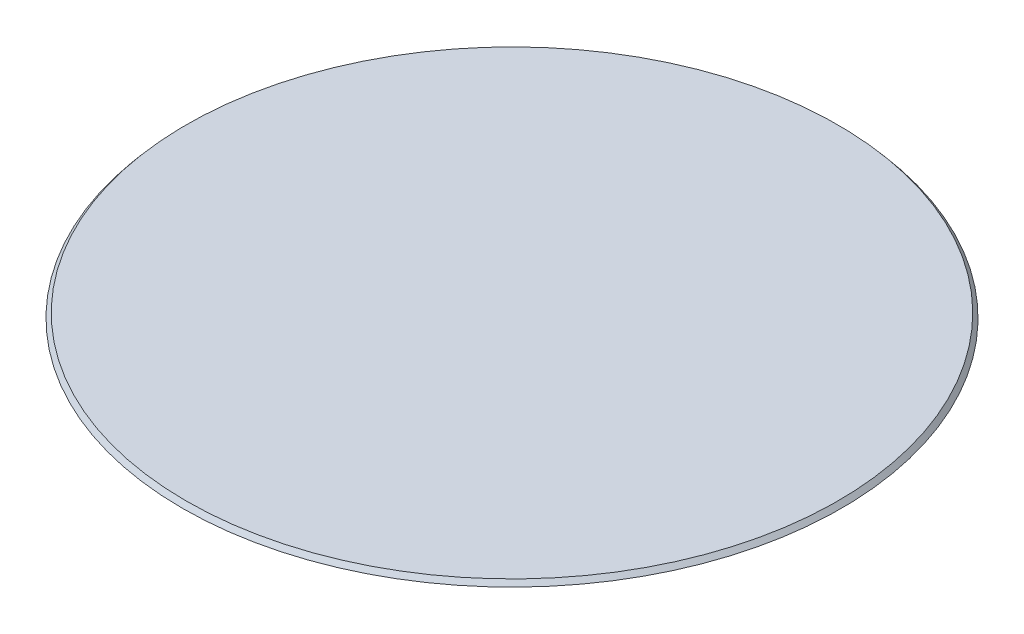
ISO-10303-21;
HEADER;
FILE_DESCRIPTION(('STEP AP214'),'2;1');
FILE_NAME('part.step','',(''),(''),'','','');
FILE_SCHEMA(('AUTOMOTIVE_DESIGN { 1 0 10303 214 1 1 1 1 }'));
ENDSEC;
DATA;
#1=APPLICATION_CONTEXT('core data for automotive mechanical design processes');
#2=APPLICATION_PROTOCOL_DEFINITION('international standard','automotive_design',2000,#1);
#3=PRODUCT_CONTEXT('',#1,'mechanical');
#4=PRODUCT('Part','Part','',(#3));
#5=PRODUCT_RELATED_PRODUCT_CATEGORY('part','',(#4));
#6=PRODUCT_DEFINITION_FORMATION('','',#4);
#7=PRODUCT_DEFINITION_CONTEXT('part definition',#1,'design');
#8=PRODUCT_DEFINITION('design','',#6,#7);
#9=PRODUCT_DEFINITION_SHAPE('','',#8);
#10=(LENGTH_UNIT() NAMED_UNIT(*) SI_UNIT(.MILLI.,.METRE.));
#11=(NAMED_UNIT(*) PLANE_ANGLE_UNIT() SI_UNIT($,.RADIAN.));
#12=(NAMED_UNIT(*) SI_UNIT($,.STERADIAN.) SOLID_ANGLE_UNIT());
#13=UNCERTAINTY_MEASURE_WITH_UNIT(LENGTH_MEASURE(1.E-05),#10,'distance_accuracy_value','');
#14=(GEOMETRIC_REPRESENTATION_CONTEXT(3) GLOBAL_UNCERTAINTY_ASSIGNED_CONTEXT((#13)) GLOBAL_UNIT_ASSIGNED_CONTEXT((#10,
#11,#12)) REPRESENTATION_CONTEXT('',''));
#15=CARTESIAN_POINT('',(0.,0.,0.));
#16=DIRECTION('',(0.,0.,1.));
#17=DIRECTION('',(1.,0.,0.));
#18=AXIS2_PLACEMENT_3D('',#15,#16,#17);
#19=CARTESIAN_POINT('',(0.,-1.9,-22.1));
#20=DIRECTION('',(0.,1.,0.));
#21=DIRECTION('',(0.,0.,1.));
#22=AXIS2_PLACEMENT_3D('',#19,#20,#21);
#23=PLANE('',#22);
#24=CARTESIAN_POINT('',(0.,-1.9,0.));
#25=DIRECTION('',(0.,-1.,0.));
#26=DIRECTION('',(0.58778525229248,0.,-0.809016994374942));
#27=AXIS2_PLACEMENT_3D('',#24,#25,#26);
#28=CIRCLE('',#27,20.5);
#29=CARTESIAN_POINT('',(3.1589869183563,-1.9,-20.2551425976134));
#30=VERTEX_POINT('',#29);
#31=CARTESIAN_POINT('',(18.2876047131677,-1.9,-9.26355837974405));
#32=VERTEX_POINT('',#31);
#33=EDGE_CURVE('E219',#30,#32,#28,.T.);
#34=ORIENTED_EDGE('',*,*,#33,.F.);
#35=DIRECTION('',(-0.183146099896373,0.,-0.983085706382077));
#36=VECTOR('',#35,1.);
#37=CARTESIAN_POINT('',(3.1589869183563,-1.9,-20.2551425976134));
#38=LINE('',#37,#36);
#39=CARTESIAN_POINT('',(4.54643522794369,-1.9,-12.8076424746455));
#40=VERTEX_POINT('',#39);
#41=EDGE_CURVE('E212',#40,#30,#38,.T.);
#42=ORIENTED_EDGE('',*,*,#41,.F.);
#43=CARTESIAN_POINT('',(10.0502544351917,-1.9,-13.8329885007329));
#44=DIRECTION('',(0.,-1.,0.));
#45=DIRECTION('',(0.58778525229248,0.,-0.809016994374942));
#46=AXIS2_PLACEMENT_3D('',#43,#44,#45);
#47=CIRCLE('',#46,5.59851411887886);
#48=CARTESIAN_POINT('',(10.7758660846307,-1.9,-8.28169603199335));
#49=VERTEX_POINT('',#48);
#50=EDGE_CURVE('E226',#49,#40,#47,.T.);
#51=ORIENTED_EDGE('',*,*,#50,.F.);
#52=DIRECTION('',(-0.991565324452772,0.,0.129607898458655));
#53=VECTOR('',#52,1.);
#54=CARTESIAN_POINT('',(10.7758660846307,-1.9,-8.28169603199335));
#55=LINE('',#54,#53);
#56=EDGE_CURVE('E222',#32,#49,#55,.T.);
#57=ORIENTED_EDGE('',*,*,#56,.F.);
#58=EDGE_LOOP('',(#34,#42,#51,#57));
#59=FACE_BOUND('',#58,.T.);
#60=CARTESIAN_POINT('',(0.,-1.9,0.));
#61=DIRECTION('',(0.,-1.,0.));
#62=DIRECTION('',(-0.951056516295155,0.,0.309016994374945));
#63=AXIS2_PLACEMENT_3D('',#60,#61,#62);
#64=CIRCLE('',#63,20.5);
#65=CARTESIAN_POINT('',(-14.4613482039165,-1.9,14.5299486621626));
#66=VERTEX_POINT('',#65);
#67=CARTESIAN_POINT('',(-20.239965998728,-1.9,-3.2548081925568));
#68=VERTEX_POINT('',#67);
#69=EDGE_CURVE('E199',#66,#68,#64,.T.);
#70=ORIENTED_EDGE('',*,*,#69,.F.);
#71=DIRECTION('',(-0.429674972681251,0.,0.902983619924175));
#72=VECTOR('',#71,1.);
#73=CARTESIAN_POINT('',(-14.4613482039165,-1.9,14.5299486621626));
#74=LINE('',#73,#72);
#75=CARTESIAN_POINT('',(-11.2062867264626,-1.9,7.68927284237837));
#76=VERTEX_POINT('',#75);
#77=EDGE_CURVE('E273',#76,#66,#74,.T.);
#78=ORIENTED_EDGE('',*,*,#77,.F.);
#79=CARTESIAN_POINT('',(-16.2616532717244,-1.9,5.28373144129351));
#80=DIRECTION('',(0.,-1.,0.));
#81=DIRECTION('',(-0.951056516295155,0.,0.309016994374945));
#82=AXIS2_PLACEMENT_3D('',#79,#80,#81);
#83=CIRCLE('',#82,5.59851411887886);
#84=CARTESIAN_POINT('',(-13.5857175831497,-1.9,0.366137666905687));
#85=VERTEX_POINT('',#84);
#86=EDGE_CURVE('E282',#85,#76,#83,.T.);
#87=ORIENTED_EDGE('',*,*,#86,.F.);
#88=DIRECTION('',(0.878374809809822,0.,0.477972481939661));
#89=VECTOR('',#88,1.);
#90=CARTESIAN_POINT('',(-13.5857175831497,-1.9,0.366137666905685));
#91=LINE('',#90,#89);
#92=EDGE_CURVE('E202',#68,#85,#91,.T.);
#93=ORIENTED_EDGE('',*,*,#92,.F.);
#94=EDGE_LOOP('',(#70,#78,#87,#93));
#95=FACE_BOUND('',#94,.T.);
#96=CARTESIAN_POINT('',(0.,-1.9,0.));
#97=DIRECTION('',(0.,1.,0.));
#98=DIRECTION('',(0.,0.,1.));
#99=AXIS2_PLACEMENT_3D('',#96,#97,#98);
#100=CIRCLE('',#99,22.1);
#101=CARTESIAN_POINT('',(0.,-1.9,22.1));
#102=VERTEX_POINT('',#101);
#103=EDGE_CURVE('E331',#102,#102,#100,.T.);
#104=ORIENTED_EDGE('',*,*,#103,.F.);
#105=EDGE_LOOP('',(#104));
#106=FACE_BOUND('',#105,.T.);
#107=CARTESIAN_POINT('',(0.,-1.9,0.));
#108=DIRECTION('',(0.,-1.,0.));
#109=DIRECTION('',(0.,0.,1.));
#110=AXIS2_PLACEMENT_3D('',#107,#108,#109);
#111=CIRCLE('',#110,20.5);
#112=CARTESIAN_POINT('',(9.35,-1.9,18.2435605077518));
#113=VERTEX_POINT('',#112);
#114=CARTESIAN_POINT('',(-9.35,-1.9,18.2435605077518));
#115=VERTEX_POINT('',#114);
#116=EDGE_CURVE('E298',#113,#115,#111,.T.);
#117=ORIENTED_EDGE('',*,*,#116,.F.);
#118=DIRECTION('',(0.726011587220577,0.,0.687682466856222));
#119=VECTOR('',#118,1.);
#120=CARTESIAN_POINT('',(9.35,-1.9,18.2435605077518));
#121=LINE('',#120,#119);
#122=CARTESIAN_POINT('',(3.85,-1.9,13.0339279973548));
#123=VERTEX_POINT('',#122);
#124=EDGE_CURVE('E303',#123,#113,#121,.T.);
#125=ORIENTED_EDGE('',*,*,#124,.F.);
#126=CARTESIAN_POINT('',(0.,-1.9,17.0985141188789));
#127=DIRECTION('',(0.,-1.,0.));
#128=DIRECTION('',(0.,0.,1.));
#129=AXIS2_PLACEMENT_3D('',#126,#127,#128);
#130=CIRCLE('',#129,5.59851411887886);
#131=CARTESIAN_POINT('',(-3.85,-1.9,13.0339279973548));
#132=VERTEX_POINT('',#131);
#133=EDGE_CURVE('E315',#132,#123,#130,.T.);
#134=ORIENTED_EDGE('',*,*,#133,.F.);
#135=DIRECTION('',(0.726011587220577,0.,-0.687682466856221));
#136=VECTOR('',#135,1.);
#137=CARTESIAN_POINT('',(-3.85,-1.9,13.0339279973548));
#138=LINE('',#137,#136);
#139=EDGE_CURVE('E312',#115,#132,#138,.T.);
#140=ORIENTED_EDGE('',*,*,#139,.F.);
#141=EDGE_LOOP('',(#117,#125,#134,#140));
#142=FACE_BOUND('',#141,.T.);
#143=CARTESIAN_POINT('',(0.,-1.9,0.));
#144=DIRECTION('',(0.,-1.,0.));
#145=DIRECTION('',(-0.587785252292469,0.,-0.809016994374951));
#146=AXIS2_PLACEMENT_3D('',#143,#144,#145);
#147=CIRCLE('',#146,20.5);
#148=CARTESIAN_POINT('',(-18.2876047131676,-1.9,-9.26355837974431));
#149=VERTEX_POINT('',#148);
#150=CARTESIAN_POINT('',(-3.15898691835601,-1.9,-20.2551425976135));
#151=VERTEX_POINT('',#150);
#152=EDGE_CURVE('E198',#149,#151,#147,.T.);
#153=ORIENTED_EDGE('',*,*,#152,.F.);
#154=DIRECTION('',(-0.99156532445277,0.,-0.12960789845867));
#155=VECTOR('',#154,1.);
#156=CARTESIAN_POINT('',(-18.2876047131676,-1.9,-9.26355837974431));
#157=LINE('',#156,#155);
#158=CARTESIAN_POINT('',(-10.7758660846306,-1.9,-8.28169603199351));
#159=VERTEX_POINT('',#158);
#160=EDGE_CURVE('E195',#159,#149,#157,.T.);
#161=ORIENTED_EDGE('',*,*,#160,.F.);
#162=CARTESIAN_POINT('',(-10.0502544351916,-1.9,-13.832988500733));
#163=DIRECTION('',(0.,-1.,0.));
#164=DIRECTION('',(-0.587785252292469,0.,-0.809016994374951));
#165=AXIS2_PLACEMENT_3D('',#162,#163,#164);
#166=CIRCLE('',#165,5.59851411887886);
#167=CARTESIAN_POINT('',(-4.54643522794351,-1.9,-12.8076424746455));
#168=VERTEX_POINT('',#167);
#169=EDGE_CURVE('E693',#168,#159,#166,.T.);
#170=ORIENTED_EDGE('',*,*,#169,.F.);
#171=DIRECTION('',(-0.183146099896387,0.,0.983085706382075));
#172=VECTOR('',#171,1.);
#173=CARTESIAN_POINT('',(-4.54643522794351,-1.9,-12.8076424746455));
#174=LINE('',#173,#172);
#175=EDGE_CURVE('E699',#151,#168,#174,.T.);
#176=ORIENTED_EDGE('',*,*,#175,.F.);
#177=EDGE_LOOP('',(#153,#161,#170,#176));
#178=FACE_BOUND('',#177,.T.);
#179=CARTESIAN_POINT('',(0.,-1.9,0.));
#180=DIRECTION('',(0.,-1.,0.));
#181=DIRECTION('',(0.95105651629515,0.,0.309016994374958));
#182=AXIS2_PLACEMENT_3D('',#179,#180,#181);
#183=CIRCLE('',#182,20.5);
#184=CARTESIAN_POINT('',(20.239965998728,-1.9,-3.25480819255651));
#185=VERTEX_POINT('',#184);
#186=CARTESIAN_POINT('',(14.4613482039163,-1.9,14.5299486621628));
#187=VERTEX_POINT('',#186);
#188=EDGE_CURVE('E253',#185,#187,#183,.T.);
#189=ORIENTED_EDGE('',*,*,#188,.F.);
#190=DIRECTION('',(0.878374809809829,0.,-0.477972481939648));
#191=VECTOR('',#190,1.);
#192=CARTESIAN_POINT('',(20.239965998728,-1.9,-3.25480819255651));
#193=LINE('',#192,#191);
#194=CARTESIAN_POINT('',(13.5857175831497,-1.9,0.366137666905871));
#195=VERTEX_POINT('',#194);
#196=EDGE_CURVE('E246',#195,#185,#193,.T.);
#197=ORIENTED_EDGE('',*,*,#196,.F.);
#198=CARTESIAN_POINT('',(16.2616532717244,-1.9,5.28373144129373));
#199=DIRECTION('',(0.,-1.,0.));
#200=DIRECTION('',(0.95105651629515,0.,0.309016994374958));
#201=AXIS2_PLACEMENT_3D('',#198,#199,#200);
#202=CIRCLE('',#201,5.59851411887886);
#203=CARTESIAN_POINT('',(11.2062867264625,-1.9,7.68927284237853));
#204=VERTEX_POINT('',#203);
#205=EDGE_CURVE('E59',#204,#195,#202,.T.);
#206=ORIENTED_EDGE('',*,*,#205,.F.);
#207=DIRECTION('',(-0.429674972681237,0.,-0.902983619924181));
#208=VECTOR('',#207,1.);
#209=CARTESIAN_POINT('',(11.2062867264625,-1.9,7.68927284237853));
#210=LINE('',#209,#208);
#211=EDGE_CURVE('E54',#187,#204,#210,.T.);
#212=ORIENTED_EDGE('',*,*,#211,.F.);
#213=EDGE_LOOP('',(#189,#197,#206,#212));
#214=FACE_BOUND('',#213,.T.);
#215=ADVANCED_FACE('F39',(#59,#95,#106,#142,#178,#214),#23,.F.);
#216=CARTESIAN_POINT('',(0.,0.,0.));
#217=DIRECTION('',(0.,-1.,0.));
#218=DIRECTION('',(0.,0.,-1.));
#219=AXIS2_PLACEMENT_3D('',#216,#217,#218);
#220=PLANE('',#219);
#221=CARTESIAN_POINT('',(0.,0.,0.));
#222=DIRECTION('',(0.,1.,0.));
#223=DIRECTION('',(0.,0.,1.));
#224=AXIS2_PLACEMENT_3D('',#221,#222,#223);
#225=CIRCLE('',#224,29.1643601475291);
#226=CARTESIAN_POINT('',(0.,0.,29.1643601475291));
#227=VERTEX_POINT('',#226);
#228=EDGE_CURVE('E11',#227,#227,#225,.T.);
#229=ORIENTED_EDGE('',*,*,#228,.T.);
#230=EDGE_LOOP('',(#229));
#231=FACE_BOUND('',#230,.T.);
#232=ADVANCED_FACE('F41',(#231),#220,.F.);
#233=CARTESIAN_POINT('',(0.,-0.399999999999998,0.));
#234=DIRECTION('',(0.,-1.,0.));
#235=DIRECTION('',(0.,0.,-1.));
#236=AXIS2_PLACEMENT_3D('',#233,#234,#235);
#237=CONICAL_SURFACE('',#236,29.5,0.698131700797735);
#238=ORIENTED_EDGE('',*,*,#228,.F.);
#239=EDGE_LOOP('',(#238));
#240=FACE_BOUND('',#239,.T.);
#241=CARTESIAN_POINT('',(0.,-0.399999999999998,0.));
#242=DIRECTION('',(0.,1.,0.));
#243=DIRECTION('',(0.,0.,1.));
#244=AXIS2_PLACEMENT_3D('',#241,#242,#243);
#245=CIRCLE('',#244,29.5);
#246=CARTESIAN_POINT('',(0.,-0.399999999999998,29.5));
#247=VERTEX_POINT('',#246);
#248=EDGE_CURVE('E47',#247,#247,#245,.T.);
#249=ORIENTED_EDGE('',*,*,#248,.T.);
#250=EDGE_LOOP('',(#249));
#251=FACE_BOUND('',#250,.T.);
#252=ADVANCED_FACE('F345',(#240,#251),#237,.T.);
#253=CARTESIAN_POINT('',(0.,-1.9,0.));
#254=DIRECTION('',(0.,1.,0.));
#255=DIRECTION('',(0.,0.,1.));
#256=AXIS2_PLACEMENT_3D('',#253,#254,#255);
#257=CONICAL_SURFACE('',#256,26.2,1.14416883366802);
#258=ORIENTED_EDGE('',*,*,#248,.F.);
#259=EDGE_LOOP('',(#258));
#260=FACE_BOUND('',#259,.T.);
#261=CARTESIAN_POINT('',(0.,-1.9,0.));
#262=DIRECTION('',(0.,1.,0.));
#263=DIRECTION('',(0.,0.,1.));
#264=AXIS2_PLACEMENT_3D('',#261,#262,#263);
#265=CIRCLE('',#264,26.2);
#266=CARTESIAN_POINT('',(0.,-1.9,26.2));
#267=VERTEX_POINT('',#266);
#268=EDGE_CURVE('E340',#267,#267,#265,.T.);
#269=ORIENTED_EDGE('',*,*,#268,.T.);
#270=EDGE_LOOP('',(#269));
#271=FACE_BOUND('',#270,.T.);
#272=ADVANCED_FACE('F347',(#260,#271),#257,.T.);
#273=CARTESIAN_POINT('',(0.,64.33779776,0.));
#274=DIRECTION('',(0.,1.,0.));
#275=DIRECTION('',(0.,0.,1.));
#276=AXIS2_PLACEMENT_3D('',#273,#274,#275);
#277=CYLINDRICAL_SURFACE('',#276,26.2);
#278=ORIENTED_EDGE('',*,*,#268,.F.);
#279=EDGE_LOOP('',(#278));
#280=FACE_BOUND('',#279,.T.);
#281=CARTESIAN_POINT('',(0.,-0.899999999999998,0.));
#282=DIRECTION('',(0.,1.,0.));
#283=DIRECTION('',(0.,0.,1.));
#284=AXIS2_PLACEMENT_3D('',#281,#282,#283);
#285=CIRCLE('',#284,26.2);
#286=CARTESIAN_POINT('',(0.,-0.899999999999998,26.2));
#287=VERTEX_POINT('',#286);
#288=EDGE_CURVE('E337',#287,#287,#285,.T.);
#289=ORIENTED_EDGE('',*,*,#288,.T.);
#290=EDGE_LOOP('',(#289));
#291=FACE_BOUND('',#290,.T.);
#292=ADVANCED_FACE('F350',(#280,#291),#277,.F.);
#293=CARTESIAN_POINT('',(0.,-0.9,-26.2));
#294=DIRECTION('',(0.,1.,0.));
#295=DIRECTION('',(0.,0.,1.));
#296=AXIS2_PLACEMENT_3D('',#293,#294,#295);
#297=PLANE('',#296);
#298=ORIENTED_EDGE('',*,*,#288,.F.);
#299=EDGE_LOOP('',(#298));
#300=FACE_BOUND('',#299,.T.);
#301=CARTESIAN_POINT('',(0.,-0.899999999999998,0.));
#302=DIRECTION('',(0.,1.,0.));
#303=DIRECTION('',(0.,0.,1.));
#304=AXIS2_PLACEMENT_3D('',#301,#302,#303);
#305=CIRCLE('',#304,22.1);
#306=CARTESIAN_POINT('',(0.,-0.899999999999998,22.1));
#307=VERTEX_POINT('',#306);
#308=EDGE_CURVE('E334',#307,#307,#305,.T.);
#309=ORIENTED_EDGE('',*,*,#308,.T.);
#310=EDGE_LOOP('',(#309));
#311=FACE_BOUND('',#310,.T.);
#312=ADVANCED_FACE('F356',(#300,#311),#297,.F.);
#313=CARTESIAN_POINT('',(0.,64.33779776,0.));
#314=DIRECTION('',(0.,1.,0.));
#315=DIRECTION('',(0.,0.,1.));
#316=AXIS2_PLACEMENT_3D('',#313,#314,#315);
#317=CYLINDRICAL_SURFACE('',#316,22.1);
#318=ORIENTED_EDGE('',*,*,#308,.F.);
#319=EDGE_LOOP('',(#318));
#320=FACE_BOUND('',#319,.T.);
#321=ORIENTED_EDGE('',*,*,#103,.T.);
#322=EDGE_LOOP('',(#321));
#323=FACE_BOUND('',#322,.T.);
#324=ADVANCED_FACE('F362',(#320,#323),#317,.T.);
#325=CARTESIAN_POINT('',(0.,-5.9,0.));
#326=DIRECTION('',(0.,1.,0.));
#327=DIRECTION('',(0.,0.,1.));
#328=AXIS2_PLACEMENT_3D('',#325,#326,#327);
#329=CYLINDRICAL_SURFACE('',#328,20.5);
#330=ORIENTED_EDGE('',*,*,#116,.T.);
#331=DIRECTION('',(0.,1.,0.));
#332=VECTOR('',#331,1.);
#333=CARTESIAN_POINT('',(-9.35,-5.9,18.2435605077518));
#334=LINE('',#333,#332);
#335=CARTESIAN_POINT('',(-9.35,-5.9,18.2435605077518));
#336=VERTEX_POINT('',#335);
#337=EDGE_CURVE('E328',#336,#115,#334,.T.);
#338=ORIENTED_EDGE('',*,*,#337,.F.);
#339=CARTESIAN_POINT('',(0.,-5.9,0.));
#340=DIRECTION('',(0.,-1.,0.));
#341=DIRECTION('',(0.,0.,1.));
#342=AXIS2_PLACEMENT_3D('',#339,#340,#341);
#343=CIRCLE('',#342,20.5);
#344=CARTESIAN_POINT('',(9.35,-5.9,18.2435605077518));
#345=VERTEX_POINT('',#344);
#346=EDGE_CURVE('E299',#345,#336,#343,.T.);
#347=ORIENTED_EDGE('',*,*,#346,.F.);
#348=DIRECTION('',(0.,1.,0.));
#349=VECTOR('',#348,1.);
#350=CARTESIAN_POINT('',(9.35,-5.9,18.2435605077518));
#351=LINE('',#350,#349);
#352=EDGE_CURVE('E309',#345,#113,#351,.T.);
#353=ORIENTED_EDGE('',*,*,#352,.T.);
#354=EDGE_LOOP('',(#330,#338,#347,#353));
#355=FACE_BOUND('',#354,.T.);
#356=ADVANCED_FACE('F368',(#355),#329,.T.);
#357=CARTESIAN_POINT('',(-3.85,-5.9,13.0339279973548));
#358=DIRECTION('',(0.687682466856222,0.,0.726011587220577));
#359=DIRECTION('',(0.726011587220577,0.,-0.687682466856222));
#360=AXIS2_PLACEMENT_3D('',#357,#358,#359);
#361=PLANE('',#360);
#362=ORIENTED_EDGE('',*,*,#139,.T.);
#363=DIRECTION('',(0.,1.,0.));
#364=VECTOR('',#363,1.);
#365=CARTESIAN_POINT('',(-3.85,-5.9,13.0339279973548));
#366=LINE('',#365,#364);
#367=CARTESIAN_POINT('',(-3.85,-5.9,13.0339279973548));
#368=VERTEX_POINT('',#367);
#369=EDGE_CURVE('E325',#368,#132,#366,.T.);
#370=ORIENTED_EDGE('',*,*,#369,.F.);
#371=DIRECTION('',(0.726011587220577,0.,-0.687682466856221));
#372=VECTOR('',#371,1.);
#373=CARTESIAN_POINT('',(-3.85,-5.9,13.0339279973548));
#374=LINE('',#373,#372);
#375=EDGE_CURVE('E302',#336,#368,#374,.T.);
#376=ORIENTED_EDGE('',*,*,#375,.F.);
#377=ORIENTED_EDGE('',*,*,#337,.T.);
#378=EDGE_LOOP('',(#362,#370,#376,#377));
#379=FACE_BOUND('',#378,.T.);
#380=ADVANCED_FACE('F437',(#379),#361,.F.);
#381=CARTESIAN_POINT('',(0.,-5.9,17.0985141188789));
#382=DIRECTION('',(0.,1.,0.));
#383=DIRECTION('',(0.,0.,1.));
#384=AXIS2_PLACEMENT_3D('',#381,#382,#383);
#385=CYLINDRICAL_SURFACE('',#384,5.59851411887886);
#386=ORIENTED_EDGE('',*,*,#133,.T.);
#387=DIRECTION('',(0.,1.,0.));
#388=VECTOR('',#387,1.);
#389=CARTESIAN_POINT('',(3.85,-5.9,13.0339279973548));
#390=LINE('',#389,#388);
#391=CARTESIAN_POINT('',(3.85,-5.9,13.0339279973548));
#392=VERTEX_POINT('',#391);
#393=EDGE_CURVE('E322',#392,#123,#390,.T.);
#394=ORIENTED_EDGE('',*,*,#393,.F.);
#395=CARTESIAN_POINT('',(0.,-5.9,17.0985141188789));
#396=DIRECTION('',(0.,-1.,0.));
#397=DIRECTION('',(0.,0.,1.));
#398=AXIS2_PLACEMENT_3D('',#395,#396,#397);
#399=CIRCLE('',#398,5.59851411887886);
#400=EDGE_CURVE('E305',#368,#392,#399,.T.);
#401=ORIENTED_EDGE('',*,*,#400,.F.);
#402=ORIENTED_EDGE('',*,*,#369,.T.);
#403=EDGE_LOOP('',(#386,#394,#401,#402));
#404=FACE_BOUND('',#403,.T.);
#405=ADVANCED_FACE('F433',(#404),#385,.T.);
#406=CARTESIAN_POINT('',(9.35,-5.9,18.2435605077518));
#407=DIRECTION('',(-0.687682466856222,0.,0.726011587220577));
#408=DIRECTION('',(0.726011587220577,0.,0.687682466856222));
#409=AXIS2_PLACEMENT_3D('',#406,#407,#408);
#410=PLANE('',#409);
#411=ORIENTED_EDGE('',*,*,#124,.T.);
#412=ORIENTED_EDGE('',*,*,#352,.F.);
#413=DIRECTION('',(0.726011587220577,0.,0.687682466856222));
#414=VECTOR('',#413,1.);
#415=CARTESIAN_POINT('',(9.35,-5.9,18.2435605077518));
#416=LINE('',#415,#414);
#417=EDGE_CURVE('E307',#392,#345,#416,.T.);
#418=ORIENTED_EDGE('',*,*,#417,.F.);
#419=ORIENTED_EDGE('',*,*,#393,.T.);
#420=EDGE_LOOP('',(#411,#412,#418,#419));
#421=FACE_BOUND('',#420,.T.);
#422=ADVANCED_FACE('F429',(#421),#410,.F.);
#423=CARTESIAN_POINT('',(0.,-5.9,0.));
#424=DIRECTION('',(0.,1.,0.));
#425=DIRECTION('',(0.,0.,1.));
#426=AXIS2_PLACEMENT_3D('',#423,#424,#425);
#427=PLANE('',#426);
#428=ORIENTED_EDGE('',*,*,#346,.T.);
#429=ORIENTED_EDGE('',*,*,#375,.T.);
#430=ORIENTED_EDGE('',*,*,#400,.T.);
#431=ORIENTED_EDGE('',*,*,#417,.T.);
#432=EDGE_LOOP('',(#428,#429,#430,#431));
#433=FACE_BOUND('',#432,.T.);
#434=ADVANCED_FACE('F425',(#433),#427,.F.);
#435=CARTESIAN_POINT('',(0.,-5.9,0.));
#436=DIRECTION('',(0.,1.,0.));
#437=DIRECTION('',(0.,0.,1.));
#438=AXIS2_PLACEMENT_3D('',#435,#436,#437);
#439=CYLINDRICAL_SURFACE('',#438,20.5);
#440=ORIENTED_EDGE('',*,*,#69,.T.);
#441=DIRECTION('',(0.,1.,0.));
#442=VECTOR('',#441,1.);
#443=CARTESIAN_POINT('',(-20.239965998728,-5.9,-3.2548081925568));
#444=LINE('',#443,#442);
#445=CARTESIAN_POINT('',(-20.239965998728,-5.9,-3.2548081925568));
#446=VERTEX_POINT('',#445);
#447=EDGE_CURVE('E295',#446,#68,#444,.T.);
#448=ORIENTED_EDGE('',*,*,#447,.F.);
#449=CARTESIAN_POINT('',(0.,-5.9,0.));
#450=DIRECTION('',(0.,-1.,0.));
#451=DIRECTION('',(-0.951056516295155,0.,0.309016994374945));
#452=AXIS2_PLACEMENT_3D('',#449,#450,#451);
#453=CIRCLE('',#452,20.5);
#454=CARTESIAN_POINT('',(-14.4613482039165,-5.9,14.5299486621626));
#455=VERTEX_POINT('',#454);
#456=EDGE_CURVE('E269',#455,#446,#453,.T.);
#457=ORIENTED_EDGE('',*,*,#456,.F.);
#458=DIRECTION('',(0.,1.,0.));
#459=VECTOR('',#458,1.);
#460=CARTESIAN_POINT('',(-14.4613482039165,-5.9,14.5299486621626));
#461=LINE('',#460,#459);
#462=EDGE_CURVE('E278',#455,#66,#461,.T.);
#463=ORIENTED_EDGE('',*,*,#462,.T.);
#464=EDGE_LOOP('',(#440,#448,#457,#463));
#465=FACE_BOUND('',#464,.T.);
#466=ADVANCED_FACE('F421',(#465),#439,.T.);
#467=CARTESIAN_POINT('',(-13.5857175831497,-5.9,0.366137666905685));
#468=DIRECTION('',(-0.477972481939661,0.,0.878374809809822));
#469=DIRECTION('',(0.878374809809822,0.,0.477972481939661));
#470=AXIS2_PLACEMENT_3D('',#467,#468,#469);
#471=PLANE('',#470);
#472=ORIENTED_EDGE('',*,*,#92,.T.);
#473=DIRECTION('',(0.,1.,0.));
#474=VECTOR('',#473,1.);
#475=CARTESIAN_POINT('',(-13.5857175831497,-5.9,0.366137666905685));
#476=LINE('',#475,#474);
#477=CARTESIAN_POINT('',(-13.5857175831497,-5.9,0.366137666905685));
#478=VERTEX_POINT('',#477);
#479=EDGE_CURVE('E292',#478,#85,#476,.T.);
#480=ORIENTED_EDGE('',*,*,#479,.F.);
#481=DIRECTION('',(0.878374809809822,0.,0.477972481939661));
#482=VECTOR('',#481,1.);
#483=CARTESIAN_POINT('',(-13.5857175831497,-5.9,0.366137666905685));
#484=LINE('',#483,#482);
#485=EDGE_CURVE('E272',#446,#478,#484,.T.);
#486=ORIENTED_EDGE('',*,*,#485,.F.);
#487=ORIENTED_EDGE('',*,*,#447,.T.);
#488=EDGE_LOOP('',(#472,#480,#486,#487));
#489=FACE_BOUND('',#488,.T.);
#490=ADVANCED_FACE('F417',(#489),#471,.F.);
#491=CARTESIAN_POINT('',(-16.2616532717244,-5.9,5.28373144129351));
#492=DIRECTION('',(0.,1.,0.));
#493=DIRECTION('',(0.,0.,1.));
#494=AXIS2_PLACEMENT_3D('',#491,#492,#493);
#495=CYLINDRICAL_SURFACE('',#494,5.59851411887886);
#496=ORIENTED_EDGE('',*,*,#86,.T.);
#497=DIRECTION('',(0.,1.,0.));
#498=VECTOR('',#497,1.);
#499=CARTESIAN_POINT('',(-11.2062867264626,-5.9,7.68927284237838));
#500=LINE('',#499,#498);
#501=CARTESIAN_POINT('',(-11.2062867264626,-5.9,7.68927284237838));
#502=VERTEX_POINT('',#501);
#503=EDGE_CURVE('E289',#502,#76,#500,.T.);
#504=ORIENTED_EDGE('',*,*,#503,.F.);
#505=CARTESIAN_POINT('',(-16.2616532717244,-5.9,5.28373144129351));
#506=DIRECTION('',(0.,-1.,0.));
#507=DIRECTION('',(-0.951056516295155,0.,0.309016994374945));
#508=AXIS2_PLACEMENT_3D('',#505,#506,#507);
#509=CIRCLE('',#508,5.59851411887886);
#510=EDGE_CURVE('E275',#478,#502,#509,.T.);
#511=ORIENTED_EDGE('',*,*,#510,.F.);
#512=ORIENTED_EDGE('',*,*,#479,.T.);
#513=EDGE_LOOP('',(#496,#504,#511,#512));
#514=FACE_BOUND('',#513,.T.);
#515=ADVANCED_FACE('F413',(#514),#495,.T.);
#516=CARTESIAN_POINT('',(-14.4613482039165,-5.9,14.5299486621626));
#517=DIRECTION('',(-0.902983619924175,0.,-0.429674972681251));
#518=DIRECTION('',(-0.429674972681251,0.,0.902983619924175));
#519=AXIS2_PLACEMENT_3D('',#516,#517,#518);
#520=PLANE('',#519);
#521=ORIENTED_EDGE('',*,*,#77,.T.);
#522=ORIENTED_EDGE('',*,*,#462,.F.);
#523=DIRECTION('',(-0.429674972681251,0.,0.902983619924175));
#524=VECTOR('',#523,1.);
#525=CARTESIAN_POINT('',(-14.4613482039165,-5.9,14.5299486621626));
#526=LINE('',#525,#524);
#527=EDGE_CURVE('E277',#502,#455,#526,.T.);
#528=ORIENTED_EDGE('',*,*,#527,.F.);
#529=ORIENTED_EDGE('',*,*,#503,.T.);
#530=EDGE_LOOP('',(#521,#522,#528,#529));
#531=FACE_BOUND('',#530,.T.);
#532=ADVANCED_FACE('F409',(#531),#520,.F.);
#533=CARTESIAN_POINT('',(0.,-5.9,0.));
#534=DIRECTION('',(0.,1.,0.));
#535=DIRECTION('',(-0.951056516295155,0.,0.309016994374945));
#536=AXIS2_PLACEMENT_3D('',#533,#534,#535);
#537=PLANE('',#536);
#538=ORIENTED_EDGE('',*,*,#456,.T.);
#539=ORIENTED_EDGE('',*,*,#485,.T.);
#540=ORIENTED_EDGE('',*,*,#510,.T.);
#541=ORIENTED_EDGE('',*,*,#527,.T.);
#542=EDGE_LOOP('',(#538,#539,#540,#541));
#543=FACE_BOUND('',#542,.T.);
#544=ADVANCED_FACE('F406',(#543),#537,.F.);
#545=CARTESIAN_POINT('',(0.,-5.9,0.));
#546=DIRECTION('',(0.,1.,0.));
#547=DIRECTION('',(0.,0.,1.));
#548=AXIS2_PLACEMENT_3D('',#545,#546,#547);
#549=CYLINDRICAL_SURFACE('',#548,20.5);
#550=ORIENTED_EDGE('',*,*,#152,.T.);
#551=DIRECTION('',(0.,1.,0.));
#552=VECTOR('',#551,1.);
#553=CARTESIAN_POINT('',(-3.15898691835601,-5.9,-20.2551425976135));
#554=LINE('',#553,#552);
#555=CARTESIAN_POINT('',(-3.15898691835601,-5.9,-20.2551425976135));
#556=VERTEX_POINT('',#555);
#557=EDGE_CURVE('E179',#556,#151,#554,.T.);
#558=ORIENTED_EDGE('',*,*,#557,.F.);
#559=CARTESIAN_POINT('',(0.,-5.9,0.));
#560=DIRECTION('',(0.,-1.,0.));
#561=DIRECTION('',(-0.587785252292469,0.,-0.809016994374951));
#562=AXIS2_PLACEMENT_3D('',#559,#560,#561);
#563=CIRCLE('',#562,20.5);
#564=CARTESIAN_POINT('',(-18.2876047131676,-5.9,-9.26355837974431));
#565=VERTEX_POINT('',#564);
#566=EDGE_CURVE('E186',#565,#556,#563,.T.);
#567=ORIENTED_EDGE('',*,*,#566,.F.);
#568=DIRECTION('',(0.,1.,0.));
#569=VECTOR('',#568,1.);
#570=CARTESIAN_POINT('',(-18.2876047131676,-5.9,-9.26355837974431));
#571=LINE('',#570,#569);
#572=EDGE_CURVE('E690',#565,#149,#571,.T.);
#573=ORIENTED_EDGE('',*,*,#572,.T.);
#574=EDGE_LOOP('',(#550,#558,#567,#573));
#575=FACE_BOUND('',#574,.T.);
#576=ADVANCED_FACE('F197',(#575),#549,.T.);
#577=CARTESIAN_POINT('',(-4.54643522794351,-5.9,-12.8076424746455));
#578=DIRECTION('',(-0.983085706382075,0.,-0.183146099896387));
#579=DIRECTION('',(-0.183146099896387,0.,0.983085706382074));
#580=AXIS2_PLACEMENT_3D('',#577,#578,#579);
#581=PLANE('',#580);
#582=ORIENTED_EDGE('',*,*,#175,.T.);
#583=DIRECTION('',(0.,1.,0.));
#584=VECTOR('',#583,1.);
#585=CARTESIAN_POINT('',(-4.54643522794351,-5.9,-12.8076424746455));
#586=LINE('',#585,#584);
#587=CARTESIAN_POINT('',(-4.54643522794351,-5.9,-12.8076424746455));
#588=VERTEX_POINT('',#587);
#589=EDGE_CURVE('E182',#588,#168,#586,.T.);
#590=ORIENTED_EDGE('',*,*,#589,.F.);
#591=DIRECTION('',(-0.183146099896387,0.,0.983085706382075));
#592=VECTOR('',#591,1.);
#593=CARTESIAN_POINT('',(-4.54643522794351,-5.9,-12.8076424746455));
#594=LINE('',#593,#592);
#595=EDGE_CURVE('E174',#556,#588,#594,.T.);
#596=ORIENTED_EDGE('',*,*,#595,.F.);
#597=ORIENTED_EDGE('',*,*,#557,.T.);
#598=EDGE_LOOP('',(#582,#590,#596,#597));
#599=FACE_BOUND('',#598,.T.);
#600=ADVANCED_FACE('F177',(#599),#581,.F.);
#601=CARTESIAN_POINT('',(-10.0502544351916,-5.9,-13.832988500733));
#602=DIRECTION('',(0.,1.,0.));
#603=DIRECTION('',(0.,0.,1.));
#604=AXIS2_PLACEMENT_3D('',#601,#602,#603);
#605=CYLINDRICAL_SURFACE('',#604,5.59851411887886);
#606=ORIENTED_EDGE('',*,*,#169,.T.);
#607=DIRECTION('',(0.,1.,0.));
#608=VECTOR('',#607,1.);
#609=CARTESIAN_POINT('',(-10.7758660846306,-5.9,-8.28169603199351));
#610=LINE('',#609,#608);
#611=CARTESIAN_POINT('',(-10.7758660846306,-5.9,-8.28169603199351));
#612=VERTEX_POINT('',#611);
#613=EDGE_CURVE('E204',#612,#159,#610,.T.);
#614=ORIENTED_EDGE('',*,*,#613,.F.);
#615=CARTESIAN_POINT('',(-10.0502544351916,-5.9,-13.832988500733));
#616=DIRECTION('',(0.,-1.,0.));
#617=DIRECTION('',(-0.587785252292469,0.,-0.809016994374951));
#618=AXIS2_PLACEMENT_3D('',#615,#616,#617);
#619=CIRCLE('',#618,5.59851411887886);
#620=EDGE_CURVE('E185',#588,#612,#619,.T.);
#621=ORIENTED_EDGE('',*,*,#620,.F.);
#622=ORIENTED_EDGE('',*,*,#589,.T.);
#623=EDGE_LOOP('',(#606,#614,#621,#622));
#624=FACE_BOUND('',#623,.T.);
#625=ADVANCED_FACE('F564',(#624),#605,.T.);
#626=CARTESIAN_POINT('',(-18.2876047131676,-5.9,-9.26355837974431));
#627=DIRECTION('',(0.12960789845867,0.,-0.99156532445277));
#628=DIRECTION('',(-0.99156532445277,0.,-0.12960789845867));
#629=AXIS2_PLACEMENT_3D('',#626,#627,#628);
#630=PLANE('',#629);
#631=ORIENTED_EDGE('',*,*,#160,.T.);
#632=ORIENTED_EDGE('',*,*,#572,.F.);
#633=DIRECTION('',(-0.99156532445277,0.,-0.12960789845867));
#634=VECTOR('',#633,1.);
#635=CARTESIAN_POINT('',(-18.2876047131676,-5.9,-9.26355837974431));
#636=LINE('',#635,#634);
#637=EDGE_CURVE('E191',#612,#565,#636,.T.);
#638=ORIENTED_EDGE('',*,*,#637,.F.);
#639=ORIENTED_EDGE('',*,*,#613,.T.);
#640=EDGE_LOOP('',(#631,#632,#638,#639));
#641=FACE_BOUND('',#640,.T.);
#642=ADVANCED_FACE('F573',(#641),#630,.F.);
#643=CARTESIAN_POINT('',(0.,-5.9,0.));
#644=DIRECTION('',(0.,1.,0.));
#645=DIRECTION('',(-0.587785252292469,0.,-0.809016994374951));
#646=AXIS2_PLACEMENT_3D('',#643,#644,#645);
#647=PLANE('',#646);
#648=ORIENTED_EDGE('',*,*,#566,.T.);
#649=ORIENTED_EDGE('',*,*,#595,.T.);
#650=ORIENTED_EDGE('',*,*,#620,.T.);
#651=ORIENTED_EDGE('',*,*,#637,.T.);
#652=EDGE_LOOP('',(#648,#649,#650,#651));
#653=FACE_BOUND('',#652,.T.);
#654=ADVANCED_FACE('F189',(#653),#647,.F.);
#655=CARTESIAN_POINT('',(0.,-5.9,0.));
#656=DIRECTION('',(0.,1.,0.));
#657=DIRECTION('',(0.,0.,1.));
#658=AXIS2_PLACEMENT_3D('',#655,#656,#657);
#659=CYLINDRICAL_SURFACE('',#658,20.5);
#660=ORIENTED_EDGE('',*,*,#33,.T.);
#661=DIRECTION('',(0.,1.,0.));
#662=VECTOR('',#661,1.);
#663=CARTESIAN_POINT('',(18.2876047131677,-5.9,-9.26355837974405));
#664=LINE('',#663,#662);
#665=CARTESIAN_POINT('',(18.2876047131677,-5.9,-9.26355837974405));
#666=VERTEX_POINT('',#665);
#667=EDGE_CURVE('E239',#666,#32,#664,.T.);
#668=ORIENTED_EDGE('',*,*,#667,.F.);
#669=CARTESIAN_POINT('',(0.,-5.9,0.));
#670=DIRECTION('',(0.,-1.,0.));
#671=DIRECTION('',(0.58778525229248,0.,-0.809016994374942));
#672=AXIS2_PLACEMENT_3D('',#669,#670,#671);
#673=CIRCLE('',#672,20.5);
#674=CARTESIAN_POINT('',(3.1589869183563,-5.9,-20.2551425976134));
#675=VERTEX_POINT('',#674);
#676=EDGE_CURVE('E208',#675,#666,#673,.T.);
#677=ORIENTED_EDGE('',*,*,#676,.F.);
#678=DIRECTION('',(0.,1.,0.));
#679=VECTOR('',#678,1.);
#680=CARTESIAN_POINT('',(3.1589869183563,-5.9,-20.2551425976134));
#681=LINE('',#680,#679);
#682=EDGE_CURVE('E218',#675,#30,#681,.T.);
#683=ORIENTED_EDGE('',*,*,#682,.T.);
#684=EDGE_LOOP('',(#660,#668,#677,#683));
#685=FACE_BOUND('',#684,.T.);
#686=ADVANCED_FACE('F592',(#685),#659,.T.);
#687=CARTESIAN_POINT('',(10.7758660846307,-5.9,-8.28169603199335));
#688=DIRECTION('',(-0.129607898458655,0.,-0.991565324452772));
#689=DIRECTION('',(-0.991565324452772,0.,0.129607898458655));
#690=AXIS2_PLACEMENT_3D('',#687,#688,#689);
#691=PLANE('',#690);
#692=ORIENTED_EDGE('',*,*,#56,.T.);
#693=DIRECTION('',(0.,1.,0.));
#694=VECTOR('',#693,1.);
#695=CARTESIAN_POINT('',(10.7758660846307,-5.9,-8.28169603199335));
#696=LINE('',#695,#694);
#697=CARTESIAN_POINT('',(10.7758660846307,-5.9,-8.28169603199335));
#698=VERTEX_POINT('',#697);
#699=EDGE_CURVE('E236',#698,#49,#696,.T.);
#700=ORIENTED_EDGE('',*,*,#699,.F.);
#701=DIRECTION('',(-0.991565324452772,0.,0.129607898458655));
#702=VECTOR('',#701,1.);
#703=CARTESIAN_POINT('',(10.7758660846307,-5.9,-8.28169603199335));
#704=LINE('',#703,#702);
#705=EDGE_CURVE('E211',#666,#698,#704,.T.);
#706=ORIENTED_EDGE('',*,*,#705,.F.);
#707=ORIENTED_EDGE('',*,*,#667,.T.);
#708=EDGE_LOOP('',(#692,#700,#706,#707));
#709=FACE_BOUND('',#708,.T.);
#710=ADVANCED_FACE('F601',(#709),#691,.F.);
#711=CARTESIAN_POINT('',(10.0502544351917,-5.9,-13.8329885007329));
#712=DIRECTION('',(0.,1.,0.));
#713=DIRECTION('',(0.,0.,1.));
#714=AXIS2_PLACEMENT_3D('',#711,#712,#713);
#715=CYLINDRICAL_SURFACE('',#714,5.59851411887886);
#716=ORIENTED_EDGE('',*,*,#50,.T.);
#717=DIRECTION('',(0.,1.,0.));
#718=VECTOR('',#717,1.);
#719=CARTESIAN_POINT('',(4.54643522794369,-5.9,-12.8076424746455));
#720=LINE('',#719,#718);
#721=CARTESIAN_POINT('',(4.54643522794369,-5.9,-12.8076424746455));
#722=VERTEX_POINT('',#721);
#723=EDGE_CURVE('E233',#722,#40,#720,.T.);
#724=ORIENTED_EDGE('',*,*,#723,.F.);
#725=CARTESIAN_POINT('',(10.0502544351917,-5.9,-13.8329885007329));
#726=DIRECTION('',(0.,-1.,0.));
#727=DIRECTION('',(0.58778525229248,0.,-0.809016994374942));
#728=AXIS2_PLACEMENT_3D('',#725,#726,#727);
#729=CIRCLE('',#728,5.59851411887886);
#730=EDGE_CURVE('E214',#698,#722,#729,.T.);
#731=ORIENTED_EDGE('',*,*,#730,.F.);
#732=ORIENTED_EDGE('',*,*,#699,.T.);
#733=EDGE_LOOP('',(#716,#724,#731,#732));
#734=FACE_BOUND('',#733,.T.);
#735=ADVANCED_FACE('F611',(#734),#715,.T.);
#736=CARTESIAN_POINT('',(3.1589869183563,-5.9,-20.2551425976134));
#737=DIRECTION('',(0.983085706382077,0.,-0.183146099896373));
#738=DIRECTION('',(-0.183146099896373,0.,-0.983085706382077));
#739=AXIS2_PLACEMENT_3D('',#736,#737,#738);
#740=PLANE('',#739);
#741=ORIENTED_EDGE('',*,*,#41,.T.);
#742=ORIENTED_EDGE('',*,*,#682,.F.);
#743=DIRECTION('',(-0.183146099896373,0.,-0.983085706382077));
#744=VECTOR('',#743,1.);
#745=CARTESIAN_POINT('',(3.1589869183563,-5.9,-20.2551425976134));
#746=LINE('',#745,#744);
#747=EDGE_CURVE('E216',#722,#675,#746,.T.);
#748=ORIENTED_EDGE('',*,*,#747,.F.);
#749=ORIENTED_EDGE('',*,*,#723,.T.);
#750=EDGE_LOOP('',(#741,#742,#748,#749));
#751=FACE_BOUND('',#750,.T.);
#752=ADVANCED_FACE('F621',(#751),#740,.F.);
#753=CARTESIAN_POINT('',(0.,-5.9,0.));
#754=DIRECTION('',(0.,1.,0.));
#755=DIRECTION('',(0.58778525229248,0.,-0.809016994374942));
#756=AXIS2_PLACEMENT_3D('',#753,#754,#755);
#757=PLANE('',#756);
#758=ORIENTED_EDGE('',*,*,#676,.T.);
#759=ORIENTED_EDGE('',*,*,#705,.T.);
#760=ORIENTED_EDGE('',*,*,#730,.T.);
#761=ORIENTED_EDGE('',*,*,#747,.T.);
#762=EDGE_LOOP('',(#758,#759,#760,#761));
#763=FACE_BOUND('',#762,.T.);
#764=ADVANCED_FACE('F402',(#763),#757,.F.);
#765=CARTESIAN_POINT('',(0.,-5.9,0.));
#766=DIRECTION('',(0.,1.,0.));
#767=DIRECTION('',(0.,0.,1.));
#768=AXIS2_PLACEMENT_3D('',#765,#766,#767);
#769=CYLINDRICAL_SURFACE('',#768,20.5);
#770=ORIENTED_EDGE('',*,*,#188,.T.);
#771=DIRECTION('',(0.,1.,0.));
#772=VECTOR('',#771,1.);
#773=CARTESIAN_POINT('',(14.4613482039163,-5.9,14.5299486621628));
#774=LINE('',#773,#772);
#775=CARTESIAN_POINT('',(14.4613482039163,-5.9,14.5299486621628));
#776=VERTEX_POINT('',#775);
#777=EDGE_CURVE('E223',#776,#187,#774,.T.);
#778=ORIENTED_EDGE('',*,*,#777,.F.);
#779=CARTESIAN_POINT('',(0.,-5.9,0.));
#780=DIRECTION('',(0.,-1.,0.));
#781=DIRECTION('',(0.95105651629515,0.,0.309016994374958));
#782=AXIS2_PLACEMENT_3D('',#779,#780,#781);
#783=CIRCLE('',#782,20.5);
#784=CARTESIAN_POINT('',(20.239965998728,-5.9,-3.25480819255651));
#785=VERTEX_POINT('',#784);
#786=EDGE_CURVE('E242',#785,#776,#783,.T.);
#787=ORIENTED_EDGE('',*,*,#786,.F.);
#788=DIRECTION('',(0.,1.,0.));
#789=VECTOR('',#788,1.);
#790=CARTESIAN_POINT('',(20.239965998728,-5.9,-3.25480819255651));
#791=LINE('',#790,#789);
#792=EDGE_CURVE('E252',#785,#185,#791,.T.);
#793=ORIENTED_EDGE('',*,*,#792,.T.);
#794=EDGE_LOOP('',(#770,#778,#787,#793));
#795=FACE_BOUND('',#794,.T.);
#796=ADVANCED_FACE('F386',(#795),#769,.T.);
#797=CARTESIAN_POINT('',(11.2062867264625,-5.9,7.68927284237853));
#798=DIRECTION('',(0.902983619924181,0.,-0.429674972681237));
#799=DIRECTION('',(-0.429674972681238,0.,-0.902983619924181));
#800=AXIS2_PLACEMENT_3D('',#797,#798,#799);
#801=PLANE('',#800);
#802=ORIENTED_EDGE('',*,*,#211,.T.);
#803=DIRECTION('',(0.,1.,0.));
#804=VECTOR('',#803,1.);
#805=CARTESIAN_POINT('',(11.2062867264625,-5.9,7.68927284237853));
#806=LINE('',#805,#804);
#807=CARTESIAN_POINT('',(11.2062867264625,-5.9,7.68927284237853));
#808=VERTEX_POINT('',#807);
#809=EDGE_CURVE('E265',#808,#204,#806,.T.);
#810=ORIENTED_EDGE('',*,*,#809,.F.);
#811=DIRECTION('',(-0.429674972681237,0.,-0.902983619924181));
#812=VECTOR('',#811,1.);
#813=CARTESIAN_POINT('',(11.2062867264625,-5.9,7.68927284237853));
#814=LINE('',#813,#812);
#815=EDGE_CURVE('E245',#776,#808,#814,.T.);
#816=ORIENTED_EDGE('',*,*,#815,.F.);
#817=ORIENTED_EDGE('',*,*,#777,.T.);
#818=EDGE_LOOP('',(#802,#810,#816,#817));
#819=FACE_BOUND('',#818,.T.);
#820=ADVANCED_FACE('F394',(#819),#801,.F.);
#821=CARTESIAN_POINT('',(16.2616532717244,-5.9,5.28373144129373));
#822=DIRECTION('',(0.,1.,0.));
#823=DIRECTION('',(0.,0.,1.));
#824=AXIS2_PLACEMENT_3D('',#821,#822,#823);
#825=CYLINDRICAL_SURFACE('',#824,5.59851411887886);
#826=ORIENTED_EDGE('',*,*,#205,.T.);
#827=DIRECTION('',(0.,1.,0.));
#828=VECTOR('',#827,1.);
#829=CARTESIAN_POINT('',(13.5857175831497,-5.9,0.366137666905872));
#830=LINE('',#829,#828);
#831=CARTESIAN_POINT('',(13.5857175831497,-5.9,0.366137666905872));
#832=VERTEX_POINT('',#831);
#833=EDGE_CURVE('E262',#832,#195,#830,.T.);
#834=ORIENTED_EDGE('',*,*,#833,.F.);
#835=CARTESIAN_POINT('',(16.2616532717244,-5.9,5.28373144129373));
#836=DIRECTION('',(0.,-1.,0.));
#837=DIRECTION('',(0.95105651629515,0.,0.309016994374958));
#838=AXIS2_PLACEMENT_3D('',#835,#836,#837);
#839=CIRCLE('',#838,5.59851411887886);
#840=EDGE_CURVE('E248',#808,#832,#839,.T.);
#841=ORIENTED_EDGE('',*,*,#840,.F.);
#842=ORIENTED_EDGE('',*,*,#809,.T.);
#843=EDGE_LOOP('',(#826,#834,#841,#842));
#844=FACE_BOUND('',#843,.T.);
#845=ADVANCED_FACE('F392',(#844),#825,.T.);
#846=CARTESIAN_POINT('',(20.239965998728,-5.9,-3.25480819255651));
#847=DIRECTION('',(0.477972481939648,0.,0.878374809809829));
#848=DIRECTION('',(0.878374809809829,0.,-0.477972481939648));
#849=AXIS2_PLACEMENT_3D('',#846,#847,#848);
#850=PLANE('',#849);
#851=ORIENTED_EDGE('',*,*,#196,.T.);
#852=ORIENTED_EDGE('',*,*,#792,.F.);
#853=DIRECTION('',(0.878374809809829,0.,-0.477972481939648));
#854=VECTOR('',#853,1.);
#855=CARTESIAN_POINT('',(20.239965998728,-5.9,-3.25480819255651));
#856=LINE('',#855,#854);
#857=EDGE_CURVE('E250',#832,#785,#856,.T.);
#858=ORIENTED_EDGE('',*,*,#857,.F.);
#859=ORIENTED_EDGE('',*,*,#833,.T.);
#860=EDGE_LOOP('',(#851,#852,#858,#859));
#861=FACE_BOUND('',#860,.T.);
#862=ADVANCED_FACE('F382',(#861),#850,.F.);
#863=CARTESIAN_POINT('',(0.,-5.9,0.));
#864=DIRECTION('',(0.,1.,0.));
#865=DIRECTION('',(0.95105651629515,0.,0.309016994374958));
#866=AXIS2_PLACEMENT_3D('',#863,#864,#865);
#867=PLANE('',#866);
#868=ORIENTED_EDGE('',*,*,#786,.T.);
#869=ORIENTED_EDGE('',*,*,#815,.T.);
#870=ORIENTED_EDGE('',*,*,#840,.T.);
#871=ORIENTED_EDGE('',*,*,#857,.T.);
#872=EDGE_LOOP('',(#868,#869,#870,#871));
#873=FACE_BOUND('',#872,.T.);
#874=ADVANCED_FACE('F388',(#873),#867,.F.);
#875=CLOSED_SHELL('',(#215,#232,#252,#272,#292,#312,#324,#356,#380,#405,#422,#434,#466,#490,
#515,#532,#544,#576,#600,#625,#642,#654,#686,#710,#735,#752,#764,#796,#820,#845,#862,#874));
#876=MANIFOLD_SOLID_BREP('B2',#875);
#877=ADVANCED_BREP_SHAPE_REPRESENTATION('',(#18,#876),#14);
#878=SHAPE_DEFINITION_REPRESENTATION(#9,#877);
ENDSEC;
END-ISO-10303-21;
